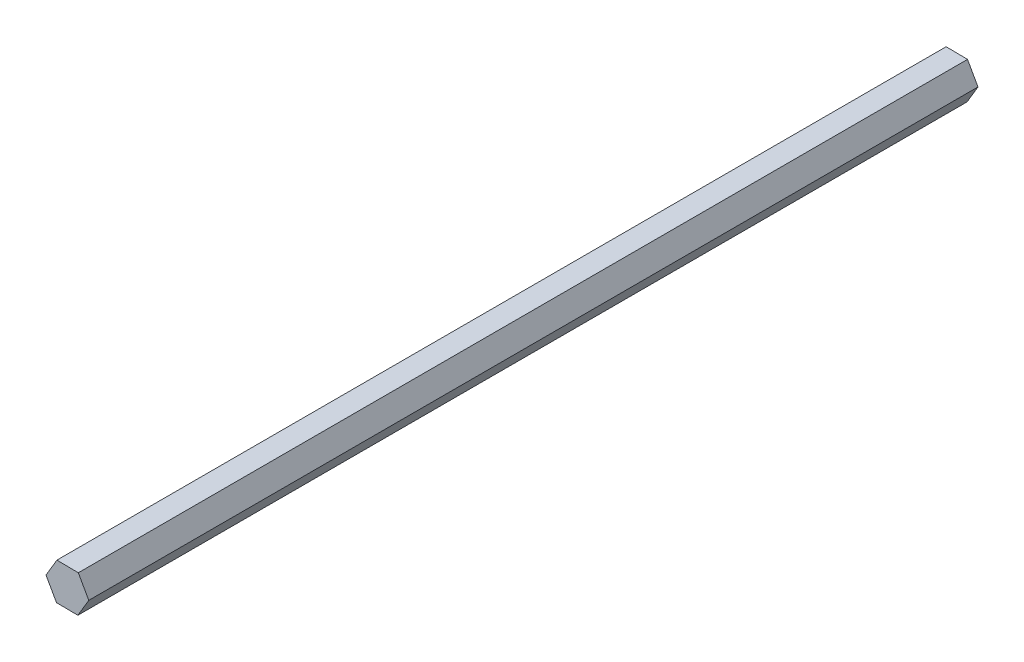
ISO-10303-21;
HEADER;
FILE_DESCRIPTION(('STEP AP214'),'2;1');
FILE_NAME('part.step','',(''),(''),'','','');
FILE_SCHEMA(('AUTOMOTIVE_DESIGN { 1 0 10303 214 1 1 1 1 }'));
ENDSEC;
DATA;
#1=APPLICATION_CONTEXT('core data for automotive mechanical design processes');
#2=APPLICATION_PROTOCOL_DEFINITION('international standard','automotive_design',2000,#1);
#3=PRODUCT_CONTEXT('',#1,'mechanical');
#4=PRODUCT('Part','Part','',(#3));
#5=PRODUCT_RELATED_PRODUCT_CATEGORY('part','',(#4));
#6=PRODUCT_DEFINITION_FORMATION('','',#4);
#7=PRODUCT_DEFINITION_CONTEXT('part definition',#1,'design');
#8=PRODUCT_DEFINITION('design','',#6,#7);
#9=PRODUCT_DEFINITION_SHAPE('','',#8);
#10=(LENGTH_UNIT() NAMED_UNIT(*) SI_UNIT(.MILLI.,.METRE.));
#11=(NAMED_UNIT(*) PLANE_ANGLE_UNIT() SI_UNIT($,.RADIAN.));
#12=(NAMED_UNIT(*) SI_UNIT($,.STERADIAN.) SOLID_ANGLE_UNIT());
#13=UNCERTAINTY_MEASURE_WITH_UNIT(LENGTH_MEASURE(1.E-05),#10,'distance_accuracy_value','');
#14=(GEOMETRIC_REPRESENTATION_CONTEXT(3) GLOBAL_UNCERTAINTY_ASSIGNED_CONTEXT((#13)) GLOBAL_UNIT_ASSIGNED_CONTEXT((#10,
#11,#12)) REPRESENTATION_CONTEXT('',''));
#15=CARTESIAN_POINT('',(0.,0.,0.));
#16=DIRECTION('',(0.,0.,1.));
#17=DIRECTION('',(1.,0.,0.));
#18=AXIS2_PLACEMENT_3D('',#15,#16,#17);
#19=CARTESIAN_POINT('',(5.49886117806557,-0.0663381064198323,228.6));
#20=DIRECTION('',(-0.871993937270013,-0.489516673224049,0.));
#21=DIRECTION('',(0.489516673224049,-0.871993937270013,0.));
#22=AXIS2_PLACEMENT_3D('',#19,#20,#21);
#23=PLANE('',#22);
#24=DIRECTION('',(-0.489516673224049,0.871993937270013,0.));
#25=VECTOR('',#24,1.);
#26=CARTESIAN_POINT('',(5.49886117806557,-0.0663381064198323,0.));
#27=LINE('',#26,#25);
#28=CARTESIAN_POINT('',(5.49886117806557,-0.0663381064198323,0.));
#29=VERTEX_POINT('',#28);
#30=CARTESIAN_POINT('',(2.80688107443131,4.72898441887889,0.));
#31=VERTEX_POINT('',#30);
#32=EDGE_CURVE('E117',#29,#31,#27,.T.);
#33=ORIENTED_EDGE('',*,*,#32,.T.);
#34=DIRECTION('',(0.,0.,-1.));
#35=VECTOR('',#34,1.);
#36=CARTESIAN_POINT('',(2.80688107443131,4.72898441887889,228.6));
#37=LINE('',#36,#35);
#38=CARTESIAN_POINT('',(2.80688107443131,4.72898441887889,228.6));
#39=VERTEX_POINT('',#38);
#40=EDGE_CURVE('E11',#39,#31,#37,.T.);
#41=ORIENTED_EDGE('',*,*,#40,.F.);
#42=DIRECTION('',(-0.489516673224049,0.871993937270013,0.));
#43=VECTOR('',#42,1.);
#44=CARTESIAN_POINT('',(5.49886117806557,-0.0663381064198323,228.6));
#45=LINE('',#44,#43);
#46=CARTESIAN_POINT('',(5.49886117806557,-0.0663381064198323,228.6));
#47=VERTEX_POINT('',#46);
#48=EDGE_CURVE('E127',#47,#39,#45,.T.);
#49=ORIENTED_EDGE('',*,*,#48,.F.);
#50=DIRECTION('',(0.,0.,-1.));
#51=VECTOR('',#50,1.);
#52=CARTESIAN_POINT('',(5.49886117806557,-0.0663381064198323,228.6));
#53=LINE('',#52,#51);
#54=EDGE_CURVE('E113',#47,#29,#53,.T.);
#55=ORIENTED_EDGE('',*,*,#54,.T.);
#56=EDGE_LOOP('',(#33,#41,#49,#55));
#57=FACE_BOUND('',#56,.T.);
#58=ADVANCED_FACE('F33',(#57),#23,.F.);
#59=CARTESIAN_POINT('',(2.80688107443131,4.72898441887889,228.6));
#60=DIRECTION('',(-0.0120630940469349,-0.99992723823387,0.));
#61=DIRECTION('',(0.99992723823387,-0.0120630940469348,0.));
#62=AXIS2_PLACEMENT_3D('',#59,#60,#61);
#63=PLANE('',#62);
#64=DIRECTION('',(-0.99992723823387,0.0120630940469348,0.));
#65=VECTOR('',#64,1.);
#66=CARTESIAN_POINT('',(2.80688107443131,4.72898441887889,0.));
#67=LINE('',#66,#65);
#68=CARTESIAN_POINT('',(-2.69198010363425,4.79532252529872,0.));
#69=VERTEX_POINT('',#68);
#70=EDGE_CURVE('E120',#31,#69,#67,.T.);
#71=ORIENTED_EDGE('',*,*,#70,.T.);
#72=DIRECTION('',(0.,0.,-1.));
#73=VECTOR('',#72,1.);
#74=CARTESIAN_POINT('',(-2.69198010363425,4.79532252529872,228.6));
#75=LINE('',#74,#73);
#76=CARTESIAN_POINT('',(-2.69198010363425,4.79532252529872,228.6));
#77=VERTEX_POINT('',#76);
#78=EDGE_CURVE('E41',#77,#69,#75,.T.);
#79=ORIENTED_EDGE('',*,*,#78,.F.);
#80=DIRECTION('',(-0.99992723823387,0.0120630940469348,0.));
#81=VECTOR('',#80,1.);
#82=CARTESIAN_POINT('',(2.80688107443131,4.72898441887889,228.6));
#83=LINE('',#82,#81);
#84=EDGE_CURVE('E86',#39,#77,#83,.T.);
#85=ORIENTED_EDGE('',*,*,#84,.F.);
#86=ORIENTED_EDGE('',*,*,#40,.T.);
#87=EDGE_LOOP('',(#71,#79,#85,#86));
#88=FACE_BOUND('',#87,.T.);
#89=ADVANCED_FACE('F151',(#88),#63,.F.);
#90=CARTESIAN_POINT('',(-2.69198010363425,4.79532252529872,228.6));
#91=DIRECTION('',(0.859930843223078,-0.510410565009822,0.));
#92=DIRECTION('',(0.510410565009822,0.859930843223078,0.));
#93=AXIS2_PLACEMENT_3D('',#90,#91,#92);
#94=PLANE('',#93);
#95=DIRECTION('',(-0.510410565009822,-0.859930843223078,0.));
#96=VECTOR('',#95,1.);
#97=CARTESIAN_POINT('',(-2.69198010363425,4.79532252529872,0.));
#98=LINE('',#97,#96);
#99=CARTESIAN_POINT('',(-5.49886117806557,0.0663381064198295,0.));
#100=VERTEX_POINT('',#99);
#101=EDGE_CURVE('E122',#69,#100,#98,.T.);
#102=ORIENTED_EDGE('',*,*,#101,.T.);
#103=DIRECTION('',(0.,0.,-1.));
#104=VECTOR('',#103,1.);
#105=CARTESIAN_POINT('',(-5.49886117806557,0.0663381064198295,228.6));
#106=LINE('',#105,#104);
#107=CARTESIAN_POINT('',(-5.49886117806557,0.0663381064198295,228.6));
#108=VERTEX_POINT('',#107);
#109=EDGE_CURVE('E108',#108,#100,#106,.T.);
#110=ORIENTED_EDGE('',*,*,#109,.F.);
#111=DIRECTION('',(-0.510410565009822,-0.859930843223078,0.));
#112=VECTOR('',#111,1.);
#113=CARTESIAN_POINT('',(-2.69198010363425,4.79532252529872,228.6));
#114=LINE('',#113,#112);
#115=EDGE_CURVE('E99',#77,#108,#114,.T.);
#116=ORIENTED_EDGE('',*,*,#115,.F.);
#117=ORIENTED_EDGE('',*,*,#78,.T.);
#118=EDGE_LOOP('',(#102,#110,#116,#117));
#119=FACE_BOUND('',#118,.T.);
#120=ADVANCED_FACE('F133',(#119),#94,.F.);
#121=CARTESIAN_POINT('',(-5.49886117806557,0.0663381064198295,228.6));
#122=DIRECTION('',(0.871993937270013,0.489516673224049,0.));
#123=DIRECTION('',(-0.489516673224049,0.871993937270013,0.));
#124=AXIS2_PLACEMENT_3D('',#121,#122,#123);
#125=PLANE('',#124);
#126=DIRECTION('',(0.489516673224049,-0.871993937270013,0.));
#127=VECTOR('',#126,1.);
#128=CARTESIAN_POINT('',(-5.49886117806557,0.0663381064198295,0.));
#129=LINE('',#128,#127);
#130=CARTESIAN_POINT('',(-2.80688107443131,-4.72898441887889,0.));
#131=VERTEX_POINT('',#130);
#132=EDGE_CURVE('E107',#100,#131,#129,.T.);
#133=ORIENTED_EDGE('',*,*,#132,.T.);
#134=DIRECTION('',(0.,0.,-1.));
#135=VECTOR('',#134,1.);
#136=CARTESIAN_POINT('',(-2.80688107443131,-4.72898441887889,228.6));
#137=LINE('',#136,#135);
#138=CARTESIAN_POINT('',(-2.80688107443131,-4.72898441887889,228.6));
#139=VERTEX_POINT('',#138);
#140=EDGE_CURVE('E104',#139,#131,#137,.T.);
#141=ORIENTED_EDGE('',*,*,#140,.F.);
#142=DIRECTION('',(0.489516673224049,-0.871993937270013,0.));
#143=VECTOR('',#142,1.);
#144=CARTESIAN_POINT('',(-5.49886117806557,0.0663381064198295,228.6));
#145=LINE('',#144,#143);
#146=EDGE_CURVE('E93',#108,#139,#145,.T.);
#147=ORIENTED_EDGE('',*,*,#146,.F.);
#148=ORIENTED_EDGE('',*,*,#109,.T.);
#149=EDGE_LOOP('',(#133,#141,#147,#148));
#150=FACE_BOUND('',#149,.T.);
#151=ADVANCED_FACE('F105',(#150),#125,.F.);
#152=CARTESIAN_POINT('',(-2.80688107443131,-4.72898441887889,228.6));
#153=DIRECTION('',(0.0120630940469353,0.99992723823387,0.));
#154=DIRECTION('',(-0.99992723823387,0.0120630940469353,0.));
#155=AXIS2_PLACEMENT_3D('',#152,#153,#154);
#156=PLANE('',#155);
#157=DIRECTION('',(0.99992723823387,-0.0120630940469353,0.));
#158=VECTOR('',#157,1.);
#159=CARTESIAN_POINT('',(-2.80688107443131,-4.72898441887889,0.));
#160=LINE('',#159,#158);
#161=CARTESIAN_POINT('',(2.69198010363426,-4.79532252529872,0.));
#162=VERTEX_POINT('',#161);
#163=EDGE_CURVE('E72',#131,#162,#160,.T.);
#164=ORIENTED_EDGE('',*,*,#163,.T.);
#165=DIRECTION('',(0.,0.,-1.));
#166=VECTOR('',#165,1.);
#167=CARTESIAN_POINT('',(2.69198010363426,-4.79532252529872,228.6));
#168=LINE('',#167,#166);
#169=CARTESIAN_POINT('',(2.69198010363426,-4.79532252529872,228.6));
#170=VERTEX_POINT('',#169);
#171=EDGE_CURVE('E109',#170,#162,#168,.T.);
#172=ORIENTED_EDGE('',*,*,#171,.F.);
#173=DIRECTION('',(0.99992723823387,-0.0120630940469353,0.));
#174=VECTOR('',#173,1.);
#175=CARTESIAN_POINT('',(-2.80688107443131,-4.72898441887889,228.6));
#176=LINE('',#175,#174);
#177=EDGE_CURVE('E97',#139,#170,#176,.T.);
#178=ORIENTED_EDGE('',*,*,#177,.F.);
#179=ORIENTED_EDGE('',*,*,#140,.T.);
#180=EDGE_LOOP('',(#164,#172,#178,#179));
#181=FACE_BOUND('',#180,.T.);
#182=ADVANCED_FACE('F111',(#181),#156,.F.);
#183=CARTESIAN_POINT('',(2.69198010363426,-4.79532252529872,228.6));
#184=DIRECTION('',(-0.859930843223079,0.510410565009822,0.));
#185=DIRECTION('',(-0.510410565009822,-0.859930843223079,0.));
#186=AXIS2_PLACEMENT_3D('',#183,#184,#185);
#187=PLANE('',#186);
#188=DIRECTION('',(0.510410565009822,0.859930843223078,0.));
#189=VECTOR('',#188,1.);
#190=CARTESIAN_POINT('',(2.69198010363426,-4.79532252529872,0.));
#191=LINE('',#190,#189);
#192=EDGE_CURVE('E78',#162,#29,#191,.T.);
#193=ORIENTED_EDGE('',*,*,#192,.T.);
#194=ORIENTED_EDGE('',*,*,#54,.F.);
#195=DIRECTION('',(0.510410565009822,0.859930843223078,0.));
#196=VECTOR('',#195,1.);
#197=CARTESIAN_POINT('',(2.69198010363426,-4.79532252529872,228.6));
#198=LINE('',#197,#196);
#199=EDGE_CURVE('E49',#170,#47,#198,.T.);
#200=ORIENTED_EDGE('',*,*,#199,.F.);
#201=ORIENTED_EDGE('',*,*,#171,.T.);
#202=EDGE_LOOP('',(#193,#194,#200,#201));
#203=FACE_BOUND('',#202,.T.);
#204=ADVANCED_FACE('F140',(#203),#187,.F.);
#205=CARTESIAN_POINT('',(0.,0.,228.6));
#206=DIRECTION('',(0.,0.,1.));
#207=DIRECTION('',(1.,0.,0.));
#208=AXIS2_PLACEMENT_3D('',#205,#206,#207);
#209=PLANE('',#208);
#210=ORIENTED_EDGE('',*,*,#48,.T.);
#211=ORIENTED_EDGE('',*,*,#84,.T.);
#212=ORIENTED_EDGE('',*,*,#115,.T.);
#213=ORIENTED_EDGE('',*,*,#146,.T.);
#214=ORIENTED_EDGE('',*,*,#177,.T.);
#215=ORIENTED_EDGE('',*,*,#199,.T.);
#216=EDGE_LOOP('',(#210,#211,#212,#213,#214,#215));
#217=FACE_BOUND('',#216,.T.);
#218=ADVANCED_FACE('F95',(#217),#209,.T.);
#219=CARTESIAN_POINT('',(0.,0.,0.));
#220=DIRECTION('',(0.,0.,1.));
#221=DIRECTION('',(1.,0.,0.));
#222=AXIS2_PLACEMENT_3D('',#219,#220,#221);
#223=PLANE('',#222);
#224=ORIENTED_EDGE('',*,*,#32,.F.);
#225=ORIENTED_EDGE('',*,*,#192,.F.);
#226=ORIENTED_EDGE('',*,*,#163,.F.);
#227=ORIENTED_EDGE('',*,*,#132,.F.);
#228=ORIENTED_EDGE('',*,*,#101,.F.);
#229=ORIENTED_EDGE('',*,*,#70,.F.);
#230=EDGE_LOOP('',(#224,#225,#226,#227,#228,#229));
#231=FACE_BOUND('',#230,.T.);
#232=ADVANCED_FACE('F136',(#231),#223,.F.);
#233=CLOSED_SHELL('',(#58,#89,#120,#151,#182,#204,#218,#232));
#234=MANIFOLD_SOLID_BREP('B2',#233);
#235=ADVANCED_BREP_SHAPE_REPRESENTATION('',(#18,#234),#14);
#236=SHAPE_DEFINITION_REPRESENTATION(#9,#235);
ENDSEC;
END-ISO-10303-21;
